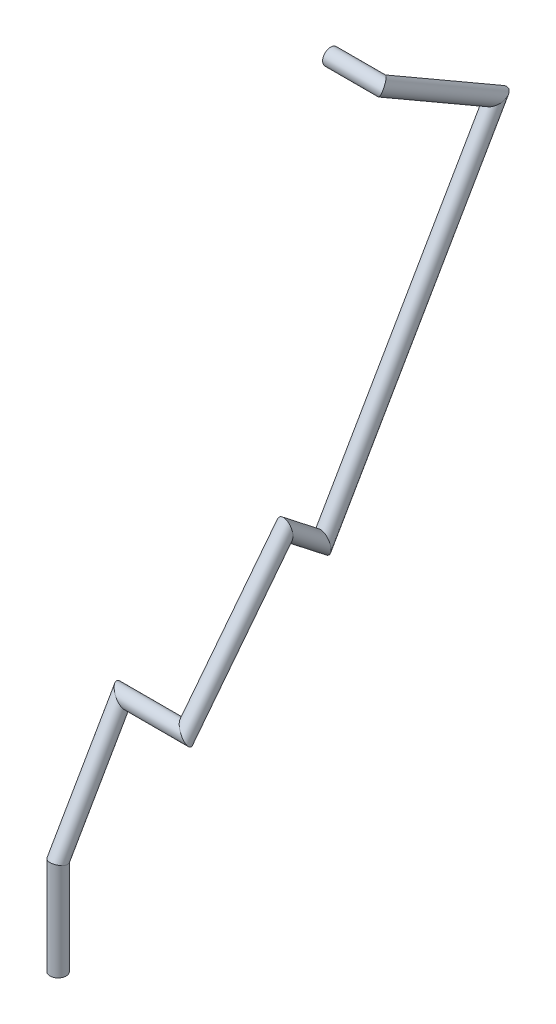
ISO-10303-21;
HEADER;
FILE_DESCRIPTION(('STEP AP214'),'2;1');
FILE_NAME('part.step','',(''),(''),'','','');
FILE_SCHEMA(('AUTOMOTIVE_DESIGN { 1 0 10303 214 1 1 1 1 }'));
ENDSEC;
DATA;
#1=APPLICATION_CONTEXT('core data for automotive mechanical design processes');
#2=APPLICATION_PROTOCOL_DEFINITION('international standard','automotive_design',2000,#1);
#3=PRODUCT_CONTEXT('',#1,'mechanical');
#4=PRODUCT('Part','Part','',(#3));
#5=PRODUCT_RELATED_PRODUCT_CATEGORY('part','',(#4));
#6=PRODUCT_DEFINITION_FORMATION('','',#4);
#7=PRODUCT_DEFINITION_CONTEXT('part definition',#1,'design');
#8=PRODUCT_DEFINITION('design','',#6,#7);
#9=PRODUCT_DEFINITION_SHAPE('','',#8);
#10=(LENGTH_UNIT() NAMED_UNIT(*) SI_UNIT(.MILLI.,.METRE.));
#11=(NAMED_UNIT(*) PLANE_ANGLE_UNIT() SI_UNIT($,.RADIAN.));
#12=(NAMED_UNIT(*) SI_UNIT($,.STERADIAN.) SOLID_ANGLE_UNIT());
#13=UNCERTAINTY_MEASURE_WITH_UNIT(LENGTH_MEASURE(1.E-05),#10,'distance_accuracy_value','');
#14=(GEOMETRIC_REPRESENTATION_CONTEXT(3) GLOBAL_UNCERTAINTY_ASSIGNED_CONTEXT((#13)) GLOBAL_UNIT_ASSIGNED_CONTEXT((#10,
#11,#12)) REPRESENTATION_CONTEXT('',''));
#15=CARTESIAN_POINT('',(0.,0.,0.));
#16=DIRECTION('',(0.,0.,1.));
#17=DIRECTION('',(1.,0.,0.));
#18=AXIS2_PLACEMENT_3D('',#15,#16,#17);
#19=CARTESIAN_POINT('',(3.97846104804477,208.837375310548,-81.096193515222));
#20=DIRECTION('',(1.,0.,0.));
#21=DIRECTION('',(0.,0.,-1.));
#22=AXIS2_PLACEMENT_3D('',#19,#20,#21);
#23=PLANE('',#22);
#24=CARTESIAN_POINT('',(3.97846104804477,208.837375310548,-81.096193515222));
#25=DIRECTION('',(1.,0.,0.));
#26=DIRECTION('',(0.,0.,-1.));
#27=AXIS2_PLACEMENT_3D('',#24,#25,#26);
#28=CIRCLE('',#27,2.5);
#29=CARTESIAN_POINT('',(3.97846104804477,208.837375310548,-83.596193515222));
#30=VERTEX_POINT('',#29);
#31=EDGE_CURVE('E48',#30,#30,#28,.T.);
#32=ORIENTED_EDGE('',*,*,#31,.F.);
#33=EDGE_LOOP('',(#32));
#34=FACE_BOUND('',#33,.T.);
#35=ADVANCED_FACE('F45',(#34),#23,.F.);
#36=CARTESIAN_POINT('',(0.,0.,-1.11022302462516E-13));
#37=DIRECTION('',(0.,-1.,0.));
#38=DIRECTION('',(-0.788010753606725,0.,-0.615661475325654));
#39=AXIS2_PLACEMENT_3D('',#36,#37,#38);
#40=PLANE('',#39);
#41=CARTESIAN_POINT('',(0.,0.,-1.11022302462516E-13));
#42=DIRECTION('',(0.,-1.,0.));
#43=DIRECTION('',(-0.788010753606725,0.,-0.615661475325654));
#44=AXIS2_PLACEMENT_3D('',#41,#42,#43);
#45=CIRCLE('',#44,2.5);
#46=CARTESIAN_POINT('',(-1.97002688401679,0.,-1.53915368831425));
#47=VERTEX_POINT('',#46);
#48=EDGE_CURVE('E53',#47,#47,#45,.T.);
#49=ORIENTED_EDGE('',*,*,#48,.T.);
#50=EDGE_LOOP('',(#49));
#51=FACE_BOUND('',#50,.T.);
#52=ADVANCED_FACE('F92',(#51),#40,.T.);
#53=CARTESIAN_POINT('',(25.2315698604074,208.837375310548,-81.096193515222));
#54=DIRECTION('',(-1.,0.,0.));
#55=DIRECTION('',(0.,0.,1.));
#56=AXIS2_PLACEMENT_3D('',#53,#54,#55);
#57=CYLINDRICAL_SURFACE('',#56,2.5);
#58=CARTESIAN_POINT('',(20.0000000000002,208.837375310548,-81.096193515222));
#59=DIRECTION('',(-0.707106781186546,0.353553390593273,0.612372435695796));
#60=DIRECTION('',(0.707106781186549,0.353553390593272,0.612372435695794));
#61=AXIS2_PLACEMENT_3D('',#58,#59,#60);
#62=ELLIPSE('',#61,3.53553390593275,2.5);
#63=CARTESIAN_POINT('',(22.5000000000002,210.087375310548,-78.9311300057608));
#64=VERTEX_POINT('',#63);
#65=EDGE_CURVE('E80',#64,#64,#62,.T.);
#66=ORIENTED_EDGE('',*,*,#65,.T.);
#67=EDGE_LOOP('',(#66));
#68=FACE_BOUND('',#67,.T.);
#69=ORIENTED_EDGE('',*,*,#31,.T.);
#70=EDGE_LOOP('',(#69));
#71=FACE_BOUND('',#70,.T.);
#72=ADVANCED_FACE('F89',(#68,#71),#57,.T.);
#73=CARTESIAN_POINT('',(20.,185.218305450141,-122.005622540966));
#74=DIRECTION('',(0.,0.499999999999998,0.866025403784439));
#75=DIRECTION('',(0.,-0.86602540378444,0.499999999999999));
#76=AXIS2_PLACEMENT_3D('',#73,#74,#75);
#77=CYLINDRICAL_SURFACE('',#76,2.5);
#78=CARTESIAN_POINT('',(20.,188.337375310548,-116.603235070384));
#79=DIRECTION('',(0.,0.965925826289068,0.258819045102521));
#80=DIRECTION('',(0.,0.258819045102521,-0.965925826289068));
#81=AXIS2_PLACEMENT_3D('',#78,#79,#80);
#82=ELLIPSE('',#81,3.53553390593275,2.5);
#83=CARTESIAN_POINT('',(20.,189.252438820009,-120.018298579845));
#84=VERTEX_POINT('',#83);
#85=EDGE_CURVE('E77',#84,#84,#82,.T.);
#86=ORIENTED_EDGE('',*,*,#85,.T.);
#87=EDGE_LOOP('',(#86));
#88=FACE_BOUND('',#87,.T.);
#89=ORIENTED_EDGE('',*,*,#65,.F.);
#90=EDGE_LOOP('',(#89));
#91=FACE_BOUND('',#90,.T.);
#92=ADVANCED_FACE('F124',(#88,#91),#77,.T.);
#93=CARTESIAN_POINT('',(20.,88.6049181181625,-59.0226740634173));
#94=DIRECTION('',(0.,0.866025403784438,-0.500000000000001));
#95=DIRECTION('',(0.,0.500000000000001,0.866025403784438));
#96=AXIS2_PLACEMENT_3D('',#93,#94,#95);
#97=CYLINDRICAL_SURFACE('',#96,2.5);
#98=CARTESIAN_POINT('',(20.,94.8066317018286,-62.6032350703839));
#99=DIRECTION('',(0.,0.190808995376544,-0.981627183447664));
#100=DIRECTION('',(0.,-0.981627183447664,-0.190808995376544));
#101=AXIS2_PLACEMENT_3D('',#98,#99,#100);
#102=ELLIPSE('',#101,3.81063271676453,2.5);
#103=CARTESIAN_POINT('',(20.,91.0660110409175,-63.3303380708187));
#104=VERTEX_POINT('',#103);
#105=EDGE_CURVE('E73',#104,#104,#102,.T.);
#106=ORIENTED_EDGE('',*,*,#105,.T.);
#107=EDGE_LOOP('',(#106));
#108=FACE_BOUND('',#107,.T.);
#109=ORIENTED_EDGE('',*,*,#85,.F.);
#110=EDGE_LOOP('',(#109));
#111=FACE_BOUND('',#110,.T.);
#112=ADVANCED_FACE('F120',(#108,#111),#97,.T.);
#113=CARTESIAN_POINT('',(20.,107.882136135518,-45.8673525837801));
#114=DIRECTION('',(0.,-0.615661475325658,-0.788010753606722));
#115=DIRECTION('',(0.,0.788010753606722,-0.615661475325658));
#116=AXIS2_PLACEMENT_3D('',#113,#114,#115);
#117=CYLINDRICAL_SURFACE('',#116,2.5);
#118=CARTESIAN_POINT('',(20.,104.041553831713,-50.783073766283));
#119=DIRECTION('',(0.,0.121869343405147,-0.992546151641322));
#120=DIRECTION('',(0.,0.992546151641322,0.121869343405147));
#121=AXIS2_PLACEMENT_3D('',#118,#119,#120);
#122=ELLIPSE('',#121,3.53553390593274,2.5);
#123=CARTESIAN_POINT('',(20.,107.550734404044,-50.3522005705804));
#124=VERTEX_POINT('',#123);
#125=EDGE_CURVE('E69',#124,#124,#122,.T.);
#126=ORIENTED_EDGE('',*,*,#125,.T.);
#127=EDGE_LOOP('',(#126));
#128=FACE_BOUND('',#127,.T.);
#129=ORIENTED_EDGE('',*,*,#105,.F.);
#130=EDGE_LOOP('',(#129));
#131=FACE_BOUND('',#130,.T.);
#132=ADVANCED_FACE('F116',(#128,#131),#117,.T.);
#133=CARTESIAN_POINT('',(20.,60.5184828431318,-16.7791239814726));
#134=DIRECTION('',(0.,0.788010753606721,-0.615661475325659));
#135=DIRECTION('',(0.,0.61566147532566,0.788010753606721));
#136=AXIS2_PLACEMENT_3D('',#133,#134,#135);
#137=CYLINDRICAL_SURFACE('',#136,2.5);
#138=CARTESIAN_POINT('',(20.,64.6410161513774,-20.0000000000001));
#139=DIRECTION('',(0.707106781186547,0.557207747523234,-0.435338404118088));
#140=DIRECTION('',(0.707106781186548,-0.557207747523234,0.435338404118088));
#141=AXIS2_PLACEMENT_3D('',#138,#139,#140);
#142=ELLIPSE('',#141,3.53553390593274,2.5);
#143=CARTESIAN_POINT('',(22.5,62.6709892673606,-18.460846311686));
#144=VERTEX_POINT('',#143);
#145=EDGE_CURVE('E65',#144,#144,#142,.T.);
#146=ORIENTED_EDGE('',*,*,#145,.T.);
#147=EDGE_LOOP('',(#146));
#148=FACE_BOUND('',#147,.T.);
#149=ORIENTED_EDGE('',*,*,#125,.F.);
#150=EDGE_LOOP('',(#149));
#151=FACE_BOUND('',#150,.T.);
#152=ADVANCED_FACE('F112',(#148,#151),#137,.T.);
#153=CARTESIAN_POINT('',(-5.65316768670952,64.6410161513774,-20.0000000000001));
#154=DIRECTION('',(1.,0.,0.));
#155=DIRECTION('',(0.,1.,0.));
#156=AXIS2_PLACEMENT_3D('',#153,#154,#155);
#157=CYLINDRICAL_SURFACE('',#156,2.5);
#158=CARTESIAN_POINT('',(0.,64.6410161513774,-20.0000000000001));
#159=DIRECTION('',(0.707106781186547,0.612372435695794,-0.353553390593275));
#160=DIRECTION('',(-0.707106781186548,0.612372435695794,-0.353553390593274));
#161=AXIS2_PLACEMENT_3D('',#158,#159,#160);
#162=ELLIPSE('',#161,3.53553390593274,2.5);
#163=CARTESIAN_POINT('',(-2.49999999999996,66.8060796608385,-21.2500000000001));
#164=VERTEX_POINT('',#163);
#165=EDGE_CURVE('E59',#164,#164,#162,.T.);
#166=ORIENTED_EDGE('',*,*,#165,.T.);
#167=EDGE_LOOP('',(#166));
#168=FACE_BOUND('',#167,.T.);
#169=ORIENTED_EDGE('',*,*,#145,.F.);
#170=EDGE_LOOP('',(#169));
#171=FACE_BOUND('',#170,.T.);
#172=ADVANCED_FACE('F105',(#168,#171),#157,.T.);
#173=CARTESIAN_POINT('',(0.,28.5147974930303,0.857482067199961));
#174=DIRECTION('',(0.,0.866025403784438,-0.500000000000001));
#175=DIRECTION('',(0.,0.500000000000001,0.866025403784438));
#176=AXIS2_PLACEMENT_3D('',#173,#174,#175);
#177=CYLINDRICAL_SURFACE('',#176,2.5);
#178=CARTESIAN_POINT('',(0.,30.,-1.11022302462516E-13));
#179=DIRECTION('',(0.,0.965925826289068,-0.258819045102521));
#180=DIRECTION('',(0.,0.258819045102521,0.965925826289068));
#181=AXIS2_PLACEMENT_3D('',#178,#179,#180);
#182=ELLIPSE('',#181,2.58819045102521,2.5);
#183=CARTESIAN_POINT('',(0.,30.6698729810778,2.49999999999989));
#184=VERTEX_POINT('',#183);
#185=EDGE_CURVE('E11',#184,#184,#182,.T.);
#186=ORIENTED_EDGE('',*,*,#185,.T.);
#187=EDGE_LOOP('',(#186));
#188=FACE_BOUND('',#187,.T.);
#189=ORIENTED_EDGE('',*,*,#165,.F.);
#190=EDGE_LOOP('',(#189));
#191=FACE_BOUND('',#190,.T.);
#192=ADVANCED_FACE('F99',(#188,#191),#177,.T.);
#193=CARTESIAN_POINT('',(0.,0.,-1.11022302462516E-13));
#194=DIRECTION('',(0.,1.,0.));
#195=DIRECTION('',(0.,0.,1.));
#196=AXIS2_PLACEMENT_3D('',#193,#194,#195);
#197=CYLINDRICAL_SURFACE('',#196,2.5);
#198=ORIENTED_EDGE('',*,*,#48,.F.);
#199=EDGE_LOOP('',(#198));
#200=FACE_BOUND('',#199,.T.);
#201=ORIENTED_EDGE('',*,*,#185,.F.);
#202=EDGE_LOOP('',(#201));
#203=FACE_BOUND('',#202,.T.);
#204=ADVANCED_FACE('F97',(#200,#203),#197,.T.);
#205=CLOSED_SHELL('',(#35,#52,#72,#92,#112,#132,#152,#172,#192,#204));
#206=MANIFOLD_SOLID_BREP('B2',#205);
#207=ADVANCED_BREP_SHAPE_REPRESENTATION('',(#18,#206),#14);
#208=SHAPE_DEFINITION_REPRESENTATION(#9,#207);
ENDSEC;
END-ISO-10303-21;
